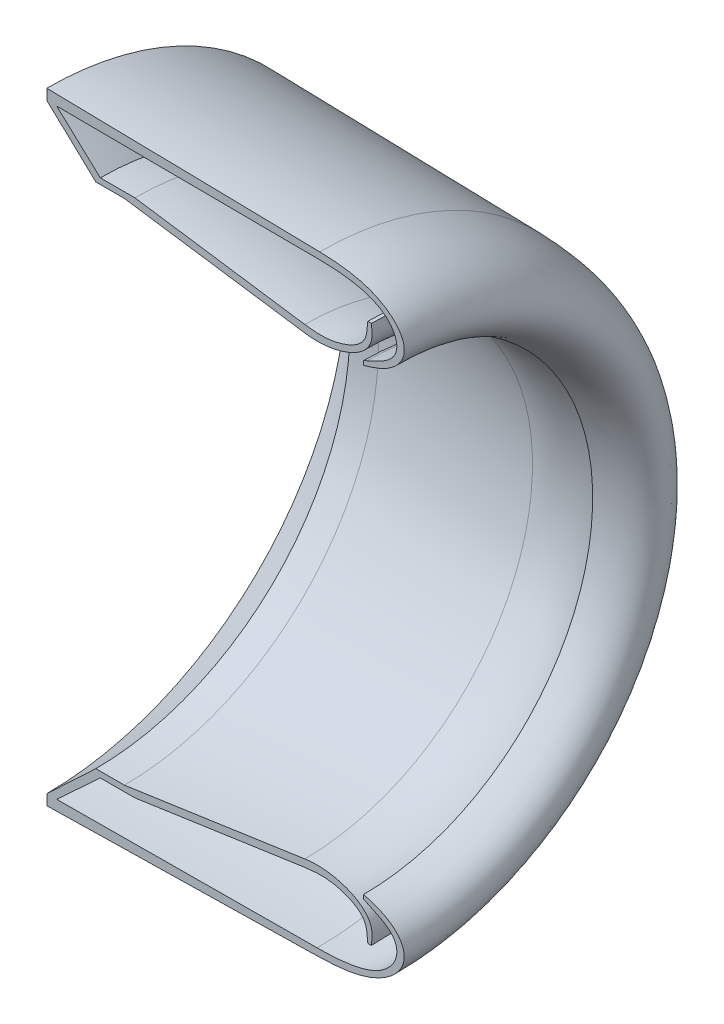
ISO-10303-21;
HEADER;
FILE_DESCRIPTION(('STEP AP214'),'2;1');
FILE_NAME('part.step','',(''),(''),'','','');
FILE_SCHEMA(('AUTOMOTIVE_DESIGN { 1 0 10303 214 1 1 1 1 }'));
ENDSEC;
DATA;
#1=APPLICATION_CONTEXT('core data for automotive mechanical design processes');
#2=APPLICATION_PROTOCOL_DEFINITION('international standard','automotive_design',2000,#1);
#3=PRODUCT_CONTEXT('',#1,'mechanical');
#4=PRODUCT('Part','Part','',(#3));
#5=PRODUCT_RELATED_PRODUCT_CATEGORY('part','',(#4));
#6=PRODUCT_DEFINITION_FORMATION('','',#4);
#7=PRODUCT_DEFINITION_CONTEXT('part definition',#1,'design');
#8=PRODUCT_DEFINITION('design','',#6,#7);
#9=PRODUCT_DEFINITION_SHAPE('','',#8);
#10=(LENGTH_UNIT() NAMED_UNIT(*) SI_UNIT(.MILLI.,.METRE.));
#11=(NAMED_UNIT(*) PLANE_ANGLE_UNIT() SI_UNIT($,.RADIAN.));
#12=(NAMED_UNIT(*) SI_UNIT($,.STERADIAN.) SOLID_ANGLE_UNIT());
#13=UNCERTAINTY_MEASURE_WITH_UNIT(LENGTH_MEASURE(1.E-05),#10,'distance_accuracy_value','');
#14=(GEOMETRIC_REPRESENTATION_CONTEXT(3) GLOBAL_UNCERTAINTY_ASSIGNED_CONTEXT((#13)) GLOBAL_UNIT_ASSIGNED_CONTEXT((#10,
#11,#12)) REPRESENTATION_CONTEXT('',''));
#15=CARTESIAN_POINT('',(0.,0.,0.));
#16=DIRECTION('',(0.,0.,1.));
#17=DIRECTION('',(1.,0.,0.));
#18=AXIS2_PLACEMENT_3D('',#15,#16,#17);
#19=CARTESIAN_POINT('',(0.,75.,0.));
#20=DIRECTION('',(-1.,0.,0.));
#21=DIRECTION('',(0.,0.,1.));
#22=AXIS2_PLACEMENT_3D('',#19,#20,#21);
#23=CYLINDRICAL_SURFACE('',#22,61.3274381914375);
#24=CARTESIAN_POINT('',(11.8502255321829,75.,0.));
#25=DIRECTION('',(-1.,0.,0.));
#26=DIRECTION('',(0.,0.,1.));
#27=AXIS2_PLACEMENT_3D('',#24,#25,#26);
#28=CIRCLE('',#27,61.3274381914375);
#29=CARTESIAN_POINT('',(11.8502255321829,136.327438191437,4.28247212008919E-13));
#30=VERTEX_POINT('',#29);
#31=CARTESIAN_POINT('',(11.8502255321829,13.6725618085625,0.));
#32=VERTEX_POINT('',#31);
#33=EDGE_CURVE('E11',#30,#32,#28,.T.);
#34=ORIENTED_EDGE('',*,*,#33,.T.);
#35=DIRECTION('',(-1.,0.,0.));
#36=VECTOR('',#35,1.);
#37=CARTESIAN_POINT('',(11.8502255321829,13.6725618085625,0.));
#38=LINE('',#37,#36);
#39=CARTESIAN_POINT('',(18.752013582639,13.6725618085625,0.));
#40=VERTEX_POINT('',#39);
#41=EDGE_CURVE('E147',#40,#32,#38,.T.);
#42=ORIENTED_EDGE('',*,*,#41,.F.);
#43=CARTESIAN_POINT('',(18.752013582639,75.,0.));
#44=DIRECTION('',(-1.,0.,0.));
#45=DIRECTION('',(0.,0.,1.));
#46=AXIS2_PLACEMENT_3D('',#43,#44,#45);
#47=CIRCLE('',#46,61.3274381914375);
#48=CARTESIAN_POINT('',(18.752013582639,136.327438191437,4.28247212008919E-13));
#49=VERTEX_POINT('',#48);
#50=EDGE_CURVE('E50',#49,#40,#47,.T.);
#51=ORIENTED_EDGE('',*,*,#50,.F.);
#52=DIRECTION('',(-1.,0.,0.));
#53=VECTOR('',#52,1.);
#54=CARTESIAN_POINT('',(11.8502255321829,136.327438191437,4.28247212008919E-13));
#55=LINE('',#54,#53);
#56=EDGE_CURVE('E149',#49,#30,#55,.T.);
#57=ORIENTED_EDGE('',*,*,#56,.T.);
#58=EDGE_LOOP('',(#34,#42,#51,#57));
#59=FACE_BOUND('',#58,.T.);
#60=ADVANCED_FACE('F35',(#59),#23,.F.);
#61=CARTESIAN_POINT('',(11.8502255321829,75.,0.));
#62=DIRECTION('',(-1.,0.,0.));
#63=DIRECTION('',(0.,0.,1.));
#64=AXIS2_PLACEMENT_3D('',#61,#62,#63);
#65=CONICAL_SURFACE('',#64,61.3274381914375,0.754554036564602);
#66=CARTESIAN_POINT('',(0.,75.,0.));
#67=DIRECTION('',(-1.,0.,0.));
#68=DIRECTION('',(0.,0.,1.));
#69=AXIS2_PLACEMENT_3D('',#66,#67,#68);
#70=CIRCLE('',#69,72.4682987791943);
#71=CARTESIAN_POINT('',(0.,147.468298779194,5.06043425690531E-13));
#72=VERTEX_POINT('',#71);
#73=CARTESIAN_POINT('',(0.,2.53170122080573,0.));
#74=VERTEX_POINT('',#73);
#75=EDGE_CURVE('E43',#72,#74,#70,.T.);
#76=ORIENTED_EDGE('',*,*,#75,.T.);
#77=DIRECTION('',(-0.728577084440917,-0.684963818042656,0.));
#78=VECTOR('',#77,1.);
#79=CARTESIAN_POINT('',(0.,2.53170122080573,0.));
#80=LINE('',#79,#78);
#81=EDGE_CURVE('E158',#32,#74,#80,.T.);
#82=ORIENTED_EDGE('',*,*,#81,.F.);
#83=ORIENTED_EDGE('',*,*,#33,.F.);
#84=DIRECTION('',(-0.728577084440917,0.684963818042656,0.));
#85=VECTOR('',#84,1.);
#86=CARTESIAN_POINT('',(0.,147.468298779194,5.06043425690531E-13));
#87=LINE('',#86,#85);
#88=EDGE_CURVE('E224',#30,#72,#87,.T.);
#89=ORIENTED_EDGE('',*,*,#88,.T.);
#90=EDGE_LOOP('',(#76,#82,#83,#89));
#91=FACE_BOUND('',#90,.T.);
#92=ADVANCED_FACE('F37',(#91),#65,.F.);
#93=CARTESIAN_POINT('',(0.,150.,5.2372220082647E-13));
#94=DIRECTION('',(-1.,0.,0.));
#95=DIRECTION('',(0.,0.,1.));
#96=AXIS2_PLACEMENT_3D('',#93,#94,#95);
#97=PLANE('',#96);
#98=CARTESIAN_POINT('',(0.,75.,0.));
#99=DIRECTION('',(-1.,0.,0.));
#100=DIRECTION('',(0.,0.,1.));
#101=AXIS2_PLACEMENT_3D('',#98,#99,#100);
#102=CIRCLE('',#101,75.);
#103=CARTESIAN_POINT('',(0.,150.,5.2372220082647E-13));
#104=VERTEX_POINT('',#103);
#105=CARTESIAN_POINT('',(0.,0.,0.));
#106=VERTEX_POINT('',#105);
#107=EDGE_CURVE('E315',#104,#106,#102,.T.);
#108=ORIENTED_EDGE('',*,*,#107,.T.);
#109=DIRECTION('',(0.,-1.,0.));
#110=VECTOR('',#109,1.);
#111=CARTESIAN_POINT('',(0.,0.,0.));
#112=LINE('',#111,#110);
#113=EDGE_CURVE('E163',#74,#106,#112,.T.);
#114=ORIENTED_EDGE('',*,*,#113,.F.);
#115=ORIENTED_EDGE('',*,*,#75,.F.);
#116=DIRECTION('',(0.,1.,0.));
#117=VECTOR('',#116,1.);
#118=CARTESIAN_POINT('',(0.,150.,5.2372220082647E-13));
#119=LINE('',#118,#117);
#120=EDGE_CURVE('E226',#72,#104,#119,.T.);
#121=ORIENTED_EDGE('',*,*,#120,.T.);
#122=EDGE_LOOP('',(#108,#114,#115,#121));
#123=FACE_BOUND('',#122,.T.);
#124=ADVANCED_FACE('F253',(#123),#97,.T.);
#125=CARTESIAN_POINT('',(0.,75.,0.));
#126=DIRECTION('',(-1.,0.,0.));
#127=DIRECTION('',(0.,0.,1.));
#128=AXIS2_PLACEMENT_3D('',#125,#126,#127);
#129=CONICAL_SURFACE('',#128,75.,0.0190879814280549);
#130=CARTESIAN_POINT('',(65.8986461709387,75.,0.));
#131=DIRECTION('',(-1.,0.,0.));
#132=DIRECTION('',(0.,0.,1.));
#133=AXIS2_PLACEMENT_3D('',#130,#131,#132);
#134=CIRCLE('',#133,73.7419750744826);
#135=CARTESIAN_POINT('',(65.8986461709387,148.741975074483,5.14937459723983E-13));
#136=VERTEX_POINT('',#135);
#137=CARTESIAN_POINT('',(65.8986461709387,1.25802492551741,0.));
#138=VERTEX_POINT('',#137);
#139=EDGE_CURVE('E313',#136,#138,#134,.T.);
#140=ORIENTED_EDGE('',*,*,#139,.T.);
#141=DIRECTION('',(0.999817830013754,0.0190868223282062,0.));
#142=VECTOR('',#141,1.);
#143=CARTESIAN_POINT('',(0.,0.,0.));
#144=LINE('',#143,#142);
#145=EDGE_CURVE('E165',#106,#138,#144,.T.);
#146=ORIENTED_EDGE('',*,*,#145,.F.);
#147=ORIENTED_EDGE('',*,*,#107,.F.);
#148=DIRECTION('',(0.999817830013754,-0.0190868223282062,0.));
#149=VECTOR('',#148,1.);
#150=CARTESIAN_POINT('',(0.,150.,5.2372220082647E-13));
#151=LINE('',#150,#149);
#152=EDGE_CURVE('E229',#104,#136,#151,.T.);
#153=ORIENTED_EDGE('',*,*,#152,.T.);
#154=EDGE_LOOP('',(#140,#146,#147,#153));
#155=FACE_BOUND('',#154,.T.);
#156=ADVANCED_FACE('F249',(#155),#129,.T.);
#157=CARTESIAN_POINT('',(65.8986461709387,148.741975074483,5.14937459723983E-13));
#158=CARTESIAN_POINT('',(71.6261804742318,148.632634726327,5.14173940153649E-13));
#159=CARTESIAN_POINT('',(75.5471970860919,147.860528368229,5.08782350271844E-13));
#160=CARTESIAN_POINT('',(83.1460051067004,147.72454698406,5.07832797341334E-13));
#161=CARTESIAN_POINT('',(83.9690789300761,143.04292646595,4.75141215992278E-13));
#162=CARTESIAN_POINT('',(91.8384314116689,139.99114423856,4.5383073459799E-13));
#163=CARTESIAN_POINT('',(86.8239541314267,136.084168162658,4.2654846647735E-13));
#164=CARTESIAN_POINT('',(85.4413967770104,132.59908348382,4.02212250236454E-13));
#165=CARTESIAN_POINT('',(80.0436255282191,131.373624080429,3.93654912959553E-13));
#166=CARTESIAN_POINT('',(76.492845436451,130.300903731369,3.86164146798469E-13));
#167=B_SPLINE_CURVE_WITH_KNOTS('',9,(#157,#158,#159,#160,#161,#162,#163,#164,#165,#166),
.UNSPECIFIED.,.F.,.F.,(10,10),(0.,1.),.UNSPECIFIED.);
#168=CARTESIAN_POINT('',(0.,75.,0.));
#169=DIRECTION('',(-1.,0.,0.));
#170=AXIS1_PLACEMENT('',#168,#169);
#171=SURFACE_OF_REVOLUTION('',#167,#170);
#172=CARTESIAN_POINT('',(76.492845436451,75.,0.));
#173=DIRECTION('',(-1.,0.,0.));
#174=DIRECTION('',(0.,0.,1.));
#175=AXIS2_PLACEMENT_3D('',#172,#173,#174);
#176=CIRCLE('',#175,55.3009037313687);
#177=CARTESIAN_POINT('',(76.492845436451,130.300903731369,3.86164146798469E-13));
#178=VERTEX_POINT('',#177);
#179=CARTESIAN_POINT('',(76.492845436451,19.6990962686313,0.));
#180=VERTEX_POINT('',#179);
#181=EDGE_CURVE('E311',#178,#180,#176,.T.);
#182=ORIENTED_EDGE('',*,*,#181,.T.);
#183=CARTESIAN_POINT('',(65.8986461709387,1.25802492551741,0.));
#184=CARTESIAN_POINT('',(71.6261804742318,1.36736527367279,0.));
#185=CARTESIAN_POINT('',(75.5471970860919,2.13947163177114,0.));
#186=CARTESIAN_POINT('',(83.1460051067004,2.27545301593973,0.));
#187=CARTESIAN_POINT('',(83.9690789300761,6.95707353405025,0.));
#188=CARTESIAN_POINT('',(91.8384314116689,10.0088557614399,0.));
#189=CARTESIAN_POINT('',(86.8239541314267,13.9158318373423,0.));
#190=CARTESIAN_POINT('',(85.4413967770104,17.4009165161795,0.));
#191=CARTESIAN_POINT('',(80.0436255282191,18.6263759195708,0.));
#192=CARTESIAN_POINT('',(76.492845436451,19.6990962686313,0.));
#193=B_SPLINE_CURVE_WITH_KNOTS('',9,(#183,#184,#185,#186,#187,#188,#189,#190,#191,#192),
.UNSPECIFIED.,.F.,.F.,(10,10),(0.,1.),.UNSPECIFIED.);
#194=EDGE_CURVE('E170',#138,#180,#193,.T.);
#195=ORIENTED_EDGE('',*,*,#194,.F.);
#196=ORIENTED_EDGE('',*,*,#139,.F.);
#197=EDGE_CURVE('E232',#136,#178,#167,.T.);
#198=ORIENTED_EDGE('',*,*,#197,.T.);
#199=EDGE_LOOP('',(#182,#195,#196,#198));
#200=FACE_BOUND('',#199,.T.);
#201=ADVANCED_FACE('F244',(#200),#171,.F.);
#202=CARTESIAN_POINT('',(76.492845436451,130.300903731369,3.86164146798469E-13));
#203=DIRECTION('',(-1.,0.,0.));
#204=DIRECTION('',(0.,0.,1.));
#205=AXIS2_PLACEMENT_3D('',#202,#203,#204);
#206=PLANE('',#205);
#207=CARTESIAN_POINT('',(76.492845436451,75.,0.));
#208=DIRECTION('',(-1.,0.,0.));
#209=DIRECTION('',(0.,0.,1.));
#210=AXIS2_PLACEMENT_3D('',#207,#208,#209);
#211=CIRCLE('',#210,56.3152664439483);
#212=CARTESIAN_POINT('',(76.492845436451,131.315266443948,3.93247403762049E-13));
#213=VERTEX_POINT('',#212);
#214=CARTESIAN_POINT('',(76.492845436451,18.6847335560517,0.));
#215=VERTEX_POINT('',#214);
#216=EDGE_CURVE('E309',#213,#215,#211,.T.);
#217=ORIENTED_EDGE('',*,*,#216,.T.);
#218=DIRECTION('',(0.,-1.,0.));
#219=VECTOR('',#218,1.);
#220=CARTESIAN_POINT('',(76.492845436451,19.6990962686313,0.));
#221=LINE('',#220,#219);
#222=EDGE_CURVE('E175',#180,#215,#221,.T.);
#223=ORIENTED_EDGE('',*,*,#222,.F.);
#224=ORIENTED_EDGE('',*,*,#181,.F.);
#225=DIRECTION('',(0.,1.,0.));
#226=VECTOR('',#225,1.);
#227=CARTESIAN_POINT('',(76.492845436451,130.300903731369,3.86164146798469E-13));
#228=LINE('',#227,#226);
#229=EDGE_CURVE('E238',#178,#213,#228,.T.);
#230=ORIENTED_EDGE('',*,*,#229,.T.);
#231=EDGE_LOOP('',(#217,#223,#224,#230));
#232=FACE_BOUND('',#231,.T.);
#233=ADVANCED_FACE('F248',(#232),#206,.T.);
#234=CARTESIAN_POINT('',(76.492845436451,75.,0.));
#235=DIRECTION('',(1.,0.,0.));
#236=DIRECTION('',(0.,0.,-1.));
#237=AXIS2_PLACEMENT_3D('',#234,#235,#236);
#238=CONICAL_SURFACE('',#237,56.3152664439483,0.414197409682456);
#239=CARTESIAN_POINT('',(77.3273000433491,75.,0.));
#240=DIRECTION('',(-1.,0.,0.));
#241=DIRECTION('',(0.,0.,1.));
#242=AXIS2_PLACEMENT_3D('',#239,#240,#241);
#243=CIRCLE('',#242,56.6821182843418);
#244=CARTESIAN_POINT('',(77.3273000433491,131.682118284342,3.95809116471757E-13));
#245=VERTEX_POINT('',#244);
#246=CARTESIAN_POINT('',(77.3273000433491,18.3178817156581,0.));
#247=VERTEX_POINT('',#246);
#248=EDGE_CURVE('E307',#245,#247,#243,.T.);
#249=ORIENTED_EDGE('',*,*,#248,.T.);
#250=DIRECTION('',(0.915439622057521,-0.402455337108583,0.));
#251=VECTOR('',#250,1.);
#252=CARTESIAN_POINT('',(76.492845436451,18.6847335560517,0.));
#253=LINE('',#252,#251);
#254=EDGE_CURVE('E181',#215,#247,#253,.T.);
#255=ORIENTED_EDGE('',*,*,#254,.F.);
#256=ORIENTED_EDGE('',*,*,#216,.F.);
#257=DIRECTION('',(0.915439622057521,0.402455337108583,0.));
#258=VECTOR('',#257,1.);
#259=CARTESIAN_POINT('',(76.492845436451,131.315266443948,3.93247403762049E-13));
#260=LINE('',#259,#258);
#261=EDGE_CURVE('E330',#213,#245,#260,.T.);
#262=ORIENTED_EDGE('',*,*,#261,.T.);
#263=EDGE_LOOP('',(#249,#255,#256,#262));
#264=FACE_BOUND('',#263,.T.);
#265=ADVANCED_FACE('F329',(#264),#238,.T.);
#266=CARTESIAN_POINT('',(77.3273000433491,131.682118284342,3.95809116471757E-13));
#267=CARTESIAN_POINT('',(80.8503986390824,133.581512812326,4.09072517570872E-13));
#268=CARTESIAN_POINT('',(86.9170084419523,134.759148832883,4.17295905950321E-13));
#269=CARTESIAN_POINT('',(85.7286299391944,138.954191798853,4.46589734412982E-13));
#270=CARTESIAN_POINT('',(84.3098234268337,140.28003657119,4.55848058974617E-13));
#271=CARTESIAN_POINT('',(84.61142585038,143.221356166034,4.76387183928558E-13));
#272=CARTESIAN_POINT('',(80.5075427484385,145.041339106895,4.89096056878616E-13));
#273=CARTESIAN_POINT('',(77.9727473934529,145.22080771586,4.90349279476835E-13));
#274=CARTESIAN_POINT('',(77.1887503268685,146.718578287689,5.0080815547965E-13));
#275=CARTESIAN_POINT('',(70.722703041989,147.042444523487,5.0306970131679E-13));
#276=CARTESIAN_POINT('',(65.2772208482399,147.076382297877,5.03306687528721E-13));
#277=B_SPLINE_CURVE_WITH_KNOTS('',10,(#266,#267,#268,#269,#270,#271,#272,#273,#274,#275,#276),
.UNSPECIFIED.,.F.,.F.,(11,11),(0.,1.),.UNSPECIFIED.);
#278=CARTESIAN_POINT('',(0.,75.,0.));
#279=DIRECTION('',(-1.,0.,0.));
#280=AXIS1_PLACEMENT('',#278,#279);
#281=SURFACE_OF_REVOLUTION('',#277,#280);
#282=CARTESIAN_POINT('',(65.2772208482399,75.,0.));
#283=DIRECTION('',(-1.,0.,0.));
#284=DIRECTION('',(0.,0.,1.));
#285=AXIS2_PLACEMENT_3D('',#282,#283,#284);
#286=CIRCLE('',#285,72.0763822978768);
#287=CARTESIAN_POINT('',(65.2772208482399,147.076382297877,5.03306687528721E-13));
#288=VERTEX_POINT('',#287);
#289=CARTESIAN_POINT('',(65.2772208482399,2.9236177021232,0.));
#290=VERTEX_POINT('',#289);
#291=EDGE_CURVE('E305',#288,#290,#286,.T.);
#292=ORIENTED_EDGE('',*,*,#291,.T.);
#293=CARTESIAN_POINT('',(77.3273000433491,18.3178817156581,0.));
#294=CARTESIAN_POINT('',(80.8503986390824,16.418487187674,0.));
#295=CARTESIAN_POINT('',(86.9170084419523,15.2408511671169,0.));
#296=CARTESIAN_POINT('',(85.7286299391944,11.0458082011466,0.));
#297=CARTESIAN_POINT('',(84.3098234268337,9.71996342880963,0.));
#298=CARTESIAN_POINT('',(84.61142585038,6.77864383396584,0.));
#299=CARTESIAN_POINT('',(80.5075427484385,4.95866089310484,0.));
#300=CARTESIAN_POINT('',(77.9727473934529,4.77919228413985,0.));
#301=CARTESIAN_POINT('',(77.1887503268685,3.28142171231137,0.));
#302=CARTESIAN_POINT('',(70.722703041989,2.95755547651348,0.));
#303=CARTESIAN_POINT('',(65.2772208482399,2.9236177021232,0.));
#304=B_SPLINE_CURVE_WITH_KNOTS('',10,(#293,#294,#295,#296,#297,#298,#299,#300,#301,#302,#303),
.UNSPECIFIED.,.F.,.F.,(11,11),(0.,1.),.UNSPECIFIED.);
#305=EDGE_CURVE('E184',#247,#290,#304,.T.);
#306=ORIENTED_EDGE('',*,*,#305,.F.);
#307=ORIENTED_EDGE('',*,*,#248,.F.);
#308=EDGE_CURVE('E337',#245,#288,#277,.T.);
#309=ORIENTED_EDGE('',*,*,#308,.T.);
#310=EDGE_LOOP('',(#292,#306,#307,#309));
#311=FACE_BOUND('',#310,.T.);
#312=ADVANCED_FACE('F335',(#311),#281,.F.);
#313=CARTESIAN_POINT('',(65.2772208482399,75.,0.));
#314=DIRECTION('',(-1.,0.,0.));
#315=DIRECTION('',(0.,0.,1.));
#316=AXIS2_PLACEMENT_3D('',#313,#314,#315);
#317=CONICAL_SURFACE('',#316,72.0763822978768,0.00623220016097873);
#318=CARTESIAN_POINT('',(2.39230105627136,75.,0.));
#319=DIRECTION('',(-1.,0.,0.));
#320=DIRECTION('',(0.,0.,1.));
#321=AXIS2_PLACEMENT_3D('',#318,#319,#320);
#322=CIRCLE('',#321,72.4682987791943);
#323=CARTESIAN_POINT('',(2.39230105627136,147.468298779194,5.06043425690531E-13));
#324=VERTEX_POINT('',#323);
#325=CARTESIAN_POINT('',(2.39230105627136,2.53170122080573,0.));
#326=VERTEX_POINT('',#325);
#327=EDGE_CURVE('E303',#324,#326,#322,.T.);
#328=ORIENTED_EDGE('',*,*,#327,.T.);
#329=DIRECTION('',(-0.999980579903434,-0.00623215981761664,0.));
#330=VECTOR('',#329,1.);
#331=CARTESIAN_POINT('',(2.39230105627136,2.53170122080573,0.));
#332=LINE('',#331,#330);
#333=EDGE_CURVE('E189',#290,#326,#332,.T.);
#334=ORIENTED_EDGE('',*,*,#333,.F.);
#335=ORIENTED_EDGE('',*,*,#291,.F.);
#336=DIRECTION('',(-0.999980579903434,0.00623215981761664,0.));
#337=VECTOR('',#336,1.);
#338=CARTESIAN_POINT('',(2.39230105627136,147.468298779194,5.06043425690531E-13));
#339=LINE('',#338,#337);
#340=EDGE_CURVE('E342',#288,#324,#339,.T.);
#341=ORIENTED_EDGE('',*,*,#340,.T.);
#342=EDGE_LOOP('',(#328,#334,#335,#341));
#343=FACE_BOUND('',#342,.T.);
#344=ADVANCED_FACE('F341',(#343),#317,.F.);
#345=CARTESIAN_POINT('',(2.39230105627136,75.,0.));
#346=DIRECTION('',(-1.,0.,0.));
#347=DIRECTION('',(0.,0.,1.));
#348=AXIS2_PLACEMENT_3D('',#345,#346,#347);
#349=CONICAL_SURFACE('',#348,72.4682987791943,0.746178001305032);
#350=CARTESIAN_POINT('',(12.9255150003522,75.,0.));
#351=DIRECTION('',(-1.,0.,0.));
#352=DIRECTION('',(0.,0.,1.));
#353=AXIS2_PLACEMENT_3D('',#350,#351,#352);
#354=CIRCLE('',#353,62.73052418698);
#355=CARTESIAN_POINT('',(12.9255150003522,137.73052418698,4.38044909149377E-13));
#356=VERTEX_POINT('',#355);
#357=CARTESIAN_POINT('',(12.9255150003522,12.26947581302,0.));
#358=VERTEX_POINT('',#357);
#359=EDGE_CURVE('E301',#356,#358,#354,.T.);
#360=ORIENTED_EDGE('',*,*,#359,.T.);
#361=DIRECTION('',(0.734288740852631,0.678837274357454,0.));
#362=VECTOR('',#361,1.);
#363=CARTESIAN_POINT('',(2.39230105627136,2.53170122080573,0.));
#364=LINE('',#363,#362);
#365=EDGE_CURVE('E195',#326,#358,#364,.T.);
#366=ORIENTED_EDGE('',*,*,#365,.F.);
#367=ORIENTED_EDGE('',*,*,#327,.F.);
#368=DIRECTION('',(0.734288740852631,-0.678837274357454,0.));
#369=VECTOR('',#368,1.);
#370=CARTESIAN_POINT('',(2.39230105627136,147.468298779194,5.06043425690531E-13));
#371=LINE('',#370,#369);
#372=EDGE_CURVE('E349',#324,#356,#371,.T.);
#373=ORIENTED_EDGE('',*,*,#372,.T.);
#374=EDGE_LOOP('',(#360,#366,#367,#373));
#375=FACE_BOUND('',#374,.T.);
#376=ADVANCED_FACE('F347',(#375),#349,.T.);
#377=CARTESIAN_POINT('',(0.,75.,0.));
#378=DIRECTION('',(-1.,0.,0.));
#379=DIRECTION('',(0.,0.,1.));
#380=AXIS2_PLACEMENT_3D('',#377,#378,#379);
#381=CYLINDRICAL_SURFACE('',#380,62.73052418698);
#382=CARTESIAN_POINT('',(21.2633091462779,75.,0.));
#383=DIRECTION('',(-1.,0.,0.));
#384=DIRECTION('',(0.,0.,1.));
#385=AXIS2_PLACEMENT_3D('',#382,#383,#384);
#386=CIRCLE('',#385,62.73052418698);
#387=CARTESIAN_POINT('',(21.2633091462779,137.73052418698,4.38044909149377E-13));
#388=VERTEX_POINT('',#387);
#389=CARTESIAN_POINT('',(21.2633091462779,12.26947581302,0.));
#390=VERTEX_POINT('',#389);
#391=EDGE_CURVE('E299',#388,#390,#386,.T.);
#392=ORIENTED_EDGE('',*,*,#391,.T.);
#393=DIRECTION('',(1.,0.,0.));
#394=VECTOR('',#393,1.);
#395=CARTESIAN_POINT('',(12.9255150003522,12.26947581302,0.));
#396=LINE('',#395,#394);
#397=EDGE_CURVE('E198',#358,#390,#396,.T.);
#398=ORIENTED_EDGE('',*,*,#397,.F.);
#399=ORIENTED_EDGE('',*,*,#359,.F.);
#400=DIRECTION('',(1.,0.,0.));
#401=VECTOR('',#400,1.);
#402=CARTESIAN_POINT('',(12.9255150003522,137.73052418698,4.38044909149377E-13));
#403=LINE('',#402,#401);
#404=EDGE_CURVE('E354',#356,#388,#403,.T.);
#405=ORIENTED_EDGE('',*,*,#404,.T.);
#406=EDGE_LOOP('',(#392,#398,#399,#405));
#407=FACE_BOUND('',#406,.T.);
#408=ADVANCED_FACE('F353',(#407),#381,.T.);
#409=CARTESIAN_POINT('',(21.2633091462779,75.,0.));
#410=DIRECTION('',(-1.,0.,0.));
#411=DIRECTION('',(0.,0.,1.));
#412=AXIS2_PLACEMENT_3D('',#409,#410,#411);
#413=CONICAL_SURFACE('',#412,62.73052418698,0.144812498238939);
#414=CARTESIAN_POINT('',(62.279965887445,75.,0.));
#415=DIRECTION('',(-1.,0.,0.));
#416=DIRECTION('',(0.,0.,1.));
#417=AXIS2_PLACEMENT_3D('',#414,#415,#416);
#418=CIRCLE('',#417,56.7489284122264);
#419=CARTESIAN_POINT('',(62.279965887445,131.748928412226,3.96275649101267E-13));
#420=VERTEX_POINT('',#419);
#421=CARTESIAN_POINT('',(62.279965887445,18.2510715877736,0.));
#422=VERTEX_POINT('',#421);
#423=EDGE_CURVE('E297',#420,#422,#418,.T.);
#424=ORIENTED_EDGE('',*,*,#423,.T.);
#425=DIRECTION('',(0.989532981063281,0.144306893071729,0.));
#426=VECTOR('',#425,1.);
#427=CARTESIAN_POINT('',(21.2633091462779,12.26947581302,0.));
#428=LINE('',#427,#426);
#429=EDGE_CURVE('E201',#390,#422,#428,.T.);
#430=ORIENTED_EDGE('',*,*,#429,.F.);
#431=ORIENTED_EDGE('',*,*,#391,.F.);
#432=DIRECTION('',(0.989532981063281,-0.144306893071729,0.));
#433=VECTOR('',#432,1.);
#434=CARTESIAN_POINT('',(21.2633091462779,137.73052418698,4.38044909149377E-13));
#435=LINE('',#434,#433);
#436=EDGE_CURVE('E361',#388,#420,#435,.T.);
#437=ORIENTED_EDGE('',*,*,#436,.T.);
#438=EDGE_LOOP('',(#424,#430,#431,#437));
#439=FACE_BOUND('',#438,.T.);
#440=ADVANCED_FACE('F359',(#439),#413,.T.);
#441=CARTESIAN_POINT('',(62.279965887445,131.748928412226,3.96275649101267E-13));
#442=CARTESIAN_POINT('',(65.8916580168507,131.222223310021,3.92597687030422E-13));
#443=CARTESIAN_POINT('',(70.2401558064831,131.047747291165,3.91379327502596E-13));
#444=CARTESIAN_POINT('',(70.6213964566271,132.229593306612,3.99632114119232E-13));
#445=CARTESIAN_POINT('',(74.7387954781833,132.915826476871,4.04424054735343E-13));
#446=CARTESIAN_POINT('',(78.2462094595088,134.364540947418,4.14540373813801E-13));
#447=CARTESIAN_POINT('',(76.9480179307784,137.37025502899,4.3552916306521E-13));
#448=CARTESIAN_POINT('',(77.5218522242351,140.045026634565,4.54206993358278E-13));
#449=B_SPLINE_CURVE_WITH_KNOTS('',7,(#441,#442,#443,#444,#445,#446,#447,#448),.UNSPECIFIED.,.F.,
.F.,(8,8),(0.,1.),.UNSPECIFIED.);
#450=CARTESIAN_POINT('',(0.,75.,0.));
#451=DIRECTION('',(-1.,0.,0.));
#452=AXIS1_PLACEMENT('',#450,#451);
#453=SURFACE_OF_REVOLUTION('',#449,#452);
#454=CARTESIAN_POINT('',(77.5218522242351,75.,0.));
#455=DIRECTION('',(-1.,0.,0.));
#456=DIRECTION('',(0.,0.,1.));
#457=AXIS2_PLACEMENT_3D('',#454,#455,#456);
#458=CIRCLE('',#457,65.0450266345652);
#459=CARTESIAN_POINT('',(77.5218522242351,140.045026634565,4.54206993358278E-13));
#460=VERTEX_POINT('',#459);
#461=CARTESIAN_POINT('',(77.5218522242351,9.95497336543474,0.));
#462=VERTEX_POINT('',#461);
#463=EDGE_CURVE('E295',#460,#462,#458,.T.);
#464=ORIENTED_EDGE('',*,*,#463,.T.);
#465=CARTESIAN_POINT('',(62.279965887445,18.2510715877736,0.));
#466=CARTESIAN_POINT('',(65.8916580168507,18.7777766899786,0.));
#467=CARTESIAN_POINT('',(70.2401558064831,18.9522527088351,0.));
#468=CARTESIAN_POINT('',(70.6213964566271,17.7704066933885,0.));
#469=CARTESIAN_POINT('',(74.7387954781833,17.0841735231291,0.));
#470=CARTESIAN_POINT('',(78.2462094595088,15.6354590525816,0.));
#471=CARTESIAN_POINT('',(76.9480179307784,12.6297449710102,0.));
#472=CARTESIAN_POINT('',(77.5218522242351,9.95497336543474,0.));
#473=B_SPLINE_CURVE_WITH_KNOTS('',7,(#465,#466,#467,#468,#469,#470,#471,#472),.UNSPECIFIED.,.F.,
.F.,(8,8),(0.,1.),.UNSPECIFIED.);
#474=EDGE_CURVE('E204',#422,#462,#473,.T.);
#475=ORIENTED_EDGE('',*,*,#474,.F.);
#476=ORIENTED_EDGE('',*,*,#423,.F.);
#477=EDGE_CURVE('E366',#420,#460,#449,.T.);
#478=ORIENTED_EDGE('',*,*,#477,.T.);
#479=EDGE_LOOP('',(#464,#475,#476,#478));
#480=FACE_BOUND('',#479,.T.);
#481=ADVANCED_FACE('F365',(#480),#453,.F.);
#482=CARTESIAN_POINT('',(77.5218522242351,75.,0.));
#483=DIRECTION('',(-1.,0.,0.));
#484=DIRECTION('',(0.,0.,1.));
#485=AXIS2_PLACEMENT_3D('',#482,#483,#484);
#486=CONICAL_SURFACE('',#485,65.0450266345652,0.0206251786300364);
#487=CARTESIAN_POINT('',(78.3707851555067,75.,0.));
#488=DIRECTION('',(-1.,0.,0.));
#489=DIRECTION('',(0.,0.,1.));
#490=AXIS2_PLACEMENT_3D('',#487,#488,#489);
#491=CIRCLE('',#490,65.02751475797);
#492=CARTESIAN_POINT('',(78.3707851555067,140.02751475797,4.54084708577598E-13));
#493=VERTEX_POINT('',#492);
#494=CARTESIAN_POINT('',(78.3707851555067,9.97248524202995,0.));
#495=VERTEX_POINT('',#494);
#496=EDGE_CURVE('E293',#493,#495,#491,.T.);
#497=ORIENTED_EDGE('',*,*,#496,.T.);
#498=DIRECTION('',(0.999787308543277,0.0206237163428658,0.));
#499=VECTOR('',#498,1.);
#500=CARTESIAN_POINT('',(77.5218522242351,9.95497336543474,0.));
#501=LINE('',#500,#499);
#502=EDGE_CURVE('E209',#462,#495,#501,.T.);
#503=ORIENTED_EDGE('',*,*,#502,.F.);
#504=ORIENTED_EDGE('',*,*,#463,.F.);
#505=DIRECTION('',(0.999787308543277,-0.0206237163428658,0.));
#506=VECTOR('',#505,1.);
#507=CARTESIAN_POINT('',(77.5218522242351,140.045026634565,4.54206993358278E-13));
#508=LINE('',#507,#506);
#509=EDGE_CURVE('E285',#460,#493,#508,.T.);
#510=ORIENTED_EDGE('',*,*,#509,.T.);
#511=EDGE_LOOP('',(#497,#503,#504,#510));
#512=FACE_BOUND('',#511,.T.);
#513=ADVANCED_FACE('F275',(#512),#486,.T.);
#514=CARTESIAN_POINT('',(78.3707851555067,140.02751475797,4.54084708577598E-13));
#515=CARTESIAN_POINT('',(78.7401561193342,137.084611683426,4.33534526244007E-13));
#516=CARTESIAN_POINT('',(78.7401561193342,135.586555162603,4.23073653470037E-13));
#517=CARTESIAN_POINT('',(77.81396623954,133.620147729121,4.09342303752909E-13));
#518=CARTESIAN_POINT('',(75.7850973056717,131.714231988698,3.96033365270719E-13));
#519=CARTESIAN_POINT('',(72.2797873732858,130.300903731369,3.86164146798469E-13));
#520=CARTESIAN_POINT('',(68.4904133845477,129.229810653243,3.78684743809587E-13));
#521=CARTESIAN_POINT('',(64.1904672365677,129.700997033573,3.81975020717668E-13));
#522=CARTESIAN_POINT('',(62.279965887445,129.979611813653,3.83920577328419E-13));
#523=B_SPLINE_CURVE_WITH_KNOTS('',8,(#514,#515,#516,#517,#518,#519,#520,#521,#522),
.UNSPECIFIED.,.F.,.F.,(9,9),(0.,1.),.UNSPECIFIED.);
#524=CARTESIAN_POINT('',(0.,75.,0.));
#525=DIRECTION('',(-1.,0.,0.));
#526=AXIS1_PLACEMENT('',#524,#525);
#527=SURFACE_OF_REVOLUTION('',#523,#526);
#528=CARTESIAN_POINT('',(62.279965887445,75.,0.));
#529=DIRECTION('',(-1.,0.,0.));
#530=DIRECTION('',(0.,0.,1.));
#531=AXIS2_PLACEMENT_3D('',#528,#529,#530);
#532=CIRCLE('',#531,54.9796118136532);
#533=CARTESIAN_POINT('',(62.279965887445,129.979611813653,3.83920577328419E-13));
#534=VERTEX_POINT('',#533);
#535=CARTESIAN_POINT('',(62.279965887445,20.0203881863468,0.));
#536=VERTEX_POINT('',#535);
#537=EDGE_CURVE('E58',#534,#536,#532,.T.);
#538=ORIENTED_EDGE('',*,*,#537,.T.);
#539=CARTESIAN_POINT('',(78.3707851555067,9.97248524202995,0.));
#540=CARTESIAN_POINT('',(78.7401561193342,12.9153883165742,0.));
#541=CARTESIAN_POINT('',(78.7401561193342,14.413444837397,0.));
#542=CARTESIAN_POINT('',(77.81396623954,16.3798522708788,0.));
#543=CARTESIAN_POINT('',(75.7850973056717,18.285768011302,0.));
#544=CARTESIAN_POINT('',(72.2797873732858,19.6990962686313,0.));
#545=CARTESIAN_POINT('',(68.4904133845477,20.7701893467573,0.));
#546=CARTESIAN_POINT('',(64.1904672365677,20.2990029664269,0.));
#547=CARTESIAN_POINT('',(62.279965887445,20.0203881863468,0.));
#548=B_SPLINE_CURVE_WITH_KNOTS('',8,(#539,#540,#541,#542,#543,#544,#545,#546,#547),
.UNSPECIFIED.,.F.,.F.,(9,9),(0.,1.),.UNSPECIFIED.);
#549=EDGE_CURVE('E215',#495,#536,#548,.T.);
#550=ORIENTED_EDGE('',*,*,#549,.F.);
#551=ORIENTED_EDGE('',*,*,#496,.F.);
#552=EDGE_CURVE('E278',#493,#534,#523,.T.);
#553=ORIENTED_EDGE('',*,*,#552,.T.);
#554=EDGE_LOOP('',(#538,#550,#551,#553));
#555=FACE_BOUND('',#554,.T.);
#556=ADVANCED_FACE('F271',(#555),#527,.F.);
#557=CARTESIAN_POINT('',(62.279965887445,75.,0.));
#558=DIRECTION('',(-1.,0.,0.));
#559=DIRECTION('',(0.,0.,1.));
#560=AXIS2_PLACEMENT_3D('',#557,#558,#559);
#561=CONICAL_SURFACE('',#560,54.9796118136532,0.14481249823894);
#562=DIRECTION('',(-0.989532981063281,0.144306893071729,0.));
#563=VECTOR('',#562,1.);
#564=CARTESIAN_POINT('',(18.752013582639,136.327438191437,4.28247212008919E-13));
#565=LINE('',#564,#563);
#566=EDGE_CURVE('E284',#534,#49,#565,.T.);
#567=ORIENTED_EDGE('',*,*,#566,.T.);
#568=ORIENTED_EDGE('',*,*,#50,.T.);
#569=DIRECTION('',(-0.989532981063281,-0.144306893071729,0.));
#570=VECTOR('',#569,1.);
#571=CARTESIAN_POINT('',(18.752013582639,13.6725618085625,0.));
#572=LINE('',#571,#570);
#573=EDGE_CURVE('E161',#536,#40,#572,.T.);
#574=ORIENTED_EDGE('',*,*,#573,.F.);
#575=ORIENTED_EDGE('',*,*,#537,.F.);
#576=EDGE_LOOP('',(#567,#568,#574,#575));
#577=FACE_BOUND('',#576,.T.);
#578=ADVANCED_FACE('F268',(#577),#561,.F.);
#579=CARTESIAN_POINT('',(74.6748386629458,132.104395938077,3.98757865567408E-13));
#580=DIRECTION('',(0.,0.,-1.));
#581=DIRECTION('',(1.,0.,0.));
#582=AXIS2_PLACEMENT_3D('',#579,#580,#581);
#583=PLANE('',#582);
#584=ORIENTED_EDGE('',*,*,#56,.F.);
#585=ORIENTED_EDGE('',*,*,#566,.F.);
#586=ORIENTED_EDGE('',*,*,#552,.F.);
#587=ORIENTED_EDGE('',*,*,#509,.F.);
#588=ORIENTED_EDGE('',*,*,#477,.F.);
#589=ORIENTED_EDGE('',*,*,#436,.F.);
#590=ORIENTED_EDGE('',*,*,#404,.F.);
#591=ORIENTED_EDGE('',*,*,#372,.F.);
#592=ORIENTED_EDGE('',*,*,#340,.F.);
#593=ORIENTED_EDGE('',*,*,#308,.F.);
#594=ORIENTED_EDGE('',*,*,#261,.F.);
#595=ORIENTED_EDGE('',*,*,#229,.F.);
#596=ORIENTED_EDGE('',*,*,#197,.F.);
#597=ORIENTED_EDGE('',*,*,#152,.F.);
#598=ORIENTED_EDGE('',*,*,#120,.F.);
#599=ORIENTED_EDGE('',*,*,#88,.F.);
#600=EDGE_LOOP('',(#584,#585,#586,#587,#588,#589,#590,#591,#592,#593,#594,#595,#596,#597,#598,#599));
#601=FACE_BOUND('',#600,.T.);
#602=ADVANCED_FACE('F266',(#601),#583,.F.);
#603=CARTESIAN_POINT('',(74.6748386629458,17.8956040619235,0.));
#604=DIRECTION('',(0.,0.,1.));
#605=DIRECTION('',(1.,0.,0.));
#606=AXIS2_PLACEMENT_3D('',#603,#604,#605);
#607=PLANE('',#606);
#608=ORIENTED_EDGE('',*,*,#41,.T.);
#609=ORIENTED_EDGE('',*,*,#81,.T.);
#610=ORIENTED_EDGE('',*,*,#113,.T.);
#611=ORIENTED_EDGE('',*,*,#145,.T.);
#612=ORIENTED_EDGE('',*,*,#194,.T.);
#613=ORIENTED_EDGE('',*,*,#222,.T.);
#614=ORIENTED_EDGE('',*,*,#254,.T.);
#615=ORIENTED_EDGE('',*,*,#305,.T.);
#616=ORIENTED_EDGE('',*,*,#333,.T.);
#617=ORIENTED_EDGE('',*,*,#365,.T.);
#618=ORIENTED_EDGE('',*,*,#397,.T.);
#619=ORIENTED_EDGE('',*,*,#429,.T.);
#620=ORIENTED_EDGE('',*,*,#474,.T.);
#621=ORIENTED_EDGE('',*,*,#502,.T.);
#622=ORIENTED_EDGE('',*,*,#549,.T.);
#623=ORIENTED_EDGE('',*,*,#573,.T.);
#624=EDGE_LOOP('',(#608,#609,#610,#611,#612,#613,#614,#615,#616,#617,#618,#619,#620,#621,#622,#623));
#625=FACE_BOUND('',#624,.T.);
#626=ADVANCED_FACE('F156',(#625),#607,.T.);
#627=CLOSED_SHELL('',(#60,#92,#124,#156,#201,#233,#265,#312,#344,#376,#408,#440,#481,#513,#556,
#578,#602,#626));
#628=MANIFOLD_SOLID_BREP('B2',#627);
#629=ADVANCED_BREP_SHAPE_REPRESENTATION('',(#18,#628),#14);
#630=SHAPE_DEFINITION_REPRESENTATION(#9,#629);
ENDSEC;
END-ISO-10303-21;
